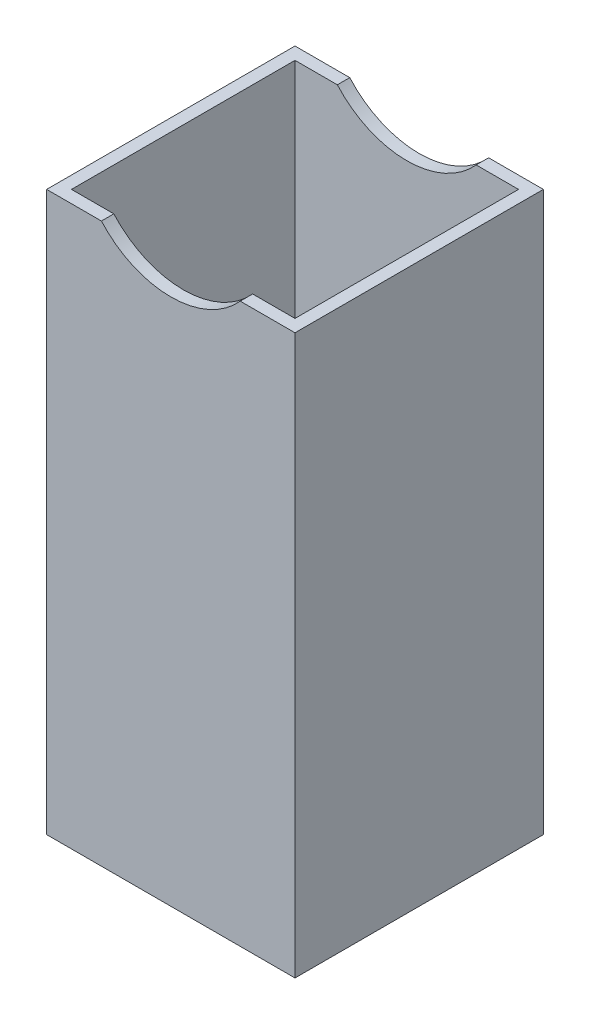
ISO-10303-21;
HEADER;
FILE_DESCRIPTION(('STEP AP214'),'2;1');
FILE_NAME('part.step','',(''),(''),'','','');
FILE_SCHEMA(('AUTOMOTIVE_DESIGN { 1 0 10303 214 1 1 1 1 }'));
ENDSEC;
DATA;
#1=APPLICATION_CONTEXT('core data for automotive mechanical design processes');
#2=APPLICATION_PROTOCOL_DEFINITION('international standard','automotive_design',2000,#1);
#3=PRODUCT_CONTEXT('',#1,'mechanical');
#4=PRODUCT('Part','Part','',(#3));
#5=PRODUCT_RELATED_PRODUCT_CATEGORY('part','',(#4));
#6=PRODUCT_DEFINITION_FORMATION('','',#4);
#7=PRODUCT_DEFINITION_CONTEXT('part definition',#1,'design');
#8=PRODUCT_DEFINITION('design','',#6,#7);
#9=PRODUCT_DEFINITION_SHAPE('','',#8);
#10=(LENGTH_UNIT() NAMED_UNIT(*) SI_UNIT(.MILLI.,.METRE.));
#11=(NAMED_UNIT(*) PLANE_ANGLE_UNIT() SI_UNIT($,.RADIAN.));
#12=(NAMED_UNIT(*) SI_UNIT($,.STERADIAN.) SOLID_ANGLE_UNIT());
#13=UNCERTAINTY_MEASURE_WITH_UNIT(LENGTH_MEASURE(1.E-05),#10,'distance_accuracy_value','');
#14=(GEOMETRIC_REPRESENTATION_CONTEXT(3) GLOBAL_UNCERTAINTY_ASSIGNED_CONTEXT((#13)) GLOBAL_UNIT_ASSIGNED_CONTEXT((#10,
#11,#12)) REPRESENTATION_CONTEXT('',''));
#15=CARTESIAN_POINT('',(0.,0.,0.));
#16=DIRECTION('',(0.,0.,1.));
#17=DIRECTION('',(1.,0.,0.));
#18=AXIS2_PLACEMENT_3D('',#15,#16,#17);
#19=CARTESIAN_POINT('',(0.,0.,0.));
#20=DIRECTION('',(0.,-1.,0.));
#21=DIRECTION('',(0.,0.,-1.));
#22=AXIS2_PLACEMENT_3D('',#19,#20,#21);
#23=PLANE('',#22);
#24=DIRECTION('',(-1.,0.,0.));
#25=VECTOR('',#24,1.);
#26=CARTESIAN_POINT('',(-20.,0.,-20.));
#27=LINE('',#26,#25);
#28=CARTESIAN_POINT('',(20.,0.,-20.));
#29=VERTEX_POINT('',#28);
#30=CARTESIAN_POINT('',(11.1803398874989,0.,-20.));
#31=VERTEX_POINT('',#30);
#32=EDGE_CURVE('E158',#29,#31,#27,.T.);
#33=ORIENTED_EDGE('',*,*,#32,.T.);
#34=DIRECTION('',(0.,0.,1.));
#35=VECTOR('',#34,1.);
#36=CARTESIAN_POINT('',(11.1803398874989,0.,-30.));
#37=LINE('',#36,#35);
#38=CARTESIAN_POINT('',(11.180339887499,0.,-18.));
#39=VERTEX_POINT('',#38);
#40=EDGE_CURVE('E217',#31,#39,#37,.T.);
#41=ORIENTED_EDGE('',*,*,#40,.T.);
#42=DIRECTION('',(-1.,0.,0.));
#43=VECTOR('',#42,1.);
#44=CARTESIAN_POINT('',(-18.,0.,-18.));
#45=LINE('',#44,#43);
#46=CARTESIAN_POINT('',(18.,0.,-18.));
#47=VERTEX_POINT('',#46);
#48=EDGE_CURVE('E179',#39,#47,#45,.F.);
#49=ORIENTED_EDGE('',*,*,#48,.T.);
#50=DIRECTION('',(0.,0.,-1.));
#51=VECTOR('',#50,1.);
#52=CARTESIAN_POINT('',(18.,0.,18.));
#53=LINE('',#52,#51);
#54=CARTESIAN_POINT('',(18.,0.,18.));
#55=VERTEX_POINT('',#54);
#56=EDGE_CURVE('E203',#47,#55,#53,.F.);
#57=ORIENTED_EDGE('',*,*,#56,.T.);
#58=DIRECTION('',(1.,0.,0.));
#59=VECTOR('',#58,1.);
#60=CARTESIAN_POINT('',(-18.,0.,18.));
#61=LINE('',#60,#59);
#62=CARTESIAN_POINT('',(11.180339887499,0.,18.));
#63=VERTEX_POINT('',#62);
#64=EDGE_CURVE('E189',#55,#63,#61,.F.);
#65=ORIENTED_EDGE('',*,*,#64,.T.);
#66=CARTESIAN_POINT('',(11.1803398874989,0.,20.));
#67=VERTEX_POINT('',#66);
#68=EDGE_CURVE('E62',#63,#67,#37,.T.);
#69=ORIENTED_EDGE('',*,*,#68,.T.);
#70=DIRECTION('',(1.,0.,0.));
#71=VECTOR('',#70,1.);
#72=CARTESIAN_POINT('',(-20.,0.,20.));
#73=LINE('',#72,#71);
#74=CARTESIAN_POINT('',(20.,0.,20.));
#75=VERTEX_POINT('',#74);
#76=EDGE_CURVE('E139',#67,#75,#73,.T.);
#77=ORIENTED_EDGE('',*,*,#76,.T.);
#78=DIRECTION('',(0.,0.,-1.));
#79=VECTOR('',#78,1.);
#80=CARTESIAN_POINT('',(20.,0.,20.));
#81=LINE('',#80,#79);
#82=EDGE_CURVE('E154',#75,#29,#81,.T.);
#83=ORIENTED_EDGE('',*,*,#82,.T.);
#84=EDGE_LOOP('',(#33,#41,#49,#57,#65,#69,#77,#83));
#85=FACE_BOUND('',#84,.T.);
#86=ADVANCED_FACE('F39',(#85),#23,.F.);
#87=CARTESIAN_POINT('',(20.,0.,20.));
#88=DIRECTION('',(-1.,0.,0.));
#89=DIRECTION('',(0.,0.,1.));
#90=AXIS2_PLACEMENT_3D('',#87,#88,#89);
#91=PLANE('',#90);
#92=DIRECTION('',(0.,-1.,0.));
#93=VECTOR('',#92,1.);
#94=CARTESIAN_POINT('',(20.,0.,-20.));
#95=LINE('',#94,#93);
#96=CARTESIAN_POINT('',(20.,-90.,-20.));
#97=VERTEX_POINT('',#96);
#98=EDGE_CURVE('E162',#29,#97,#95,.T.);
#99=ORIENTED_EDGE('',*,*,#98,.F.);
#100=ORIENTED_EDGE('',*,*,#82,.F.);
#101=DIRECTION('',(0.,-1.,0.));
#102=VECTOR('',#101,1.);
#103=CARTESIAN_POINT('',(20.,0.,20.));
#104=LINE('',#103,#102);
#105=CARTESIAN_POINT('',(20.,-90.,20.));
#106=VERTEX_POINT('',#105);
#107=EDGE_CURVE('E166',#75,#106,#104,.T.);
#108=ORIENTED_EDGE('',*,*,#107,.T.);
#109=DIRECTION('',(0.,0.,-1.));
#110=VECTOR('',#109,1.);
#111=CARTESIAN_POINT('',(20.,-90.,20.));
#112=LINE('',#111,#110);
#113=EDGE_CURVE('E145',#106,#97,#112,.T.);
#114=ORIENTED_EDGE('',*,*,#113,.T.);
#115=EDGE_LOOP('',(#99,#100,#108,#114));
#116=FACE_BOUND('',#115,.T.);
#117=ADVANCED_FACE('F229',(#116),#91,.F.);
#118=CARTESIAN_POINT('',(-20.,0.,-20.));
#119=DIRECTION('',(0.,0.,1.));
#120=DIRECTION('',(1.,0.,0.));
#121=AXIS2_PLACEMENT_3D('',#118,#119,#120);
#122=PLANE('',#121);
#123=CARTESIAN_POINT('',(-11.1803398874989,0.,-20.));
#124=VERTEX_POINT('',#123);
#125=CARTESIAN_POINT('',(-20.,0.,-20.));
#126=VERTEX_POINT('',#125);
#127=EDGE_CURVE('E156',#124,#126,#27,.T.);
#128=ORIENTED_EDGE('',*,*,#127,.F.);
#129=CARTESIAN_POINT('',(0.,10.,-20.));
#130=DIRECTION('',(0.,0.,1.));
#131=DIRECTION('',(1.,0.,0.));
#132=AXIS2_PLACEMENT_3D('',#129,#130,#131);
#133=CIRCLE('',#132,15.);
#134=EDGE_CURVE('E169',#124,#31,#133,.T.);
#135=ORIENTED_EDGE('',*,*,#134,.T.);
#136=ORIENTED_EDGE('',*,*,#32,.F.);
#137=ORIENTED_EDGE('',*,*,#98,.T.);
#138=DIRECTION('',(-1.,0.,0.));
#139=VECTOR('',#138,1.);
#140=CARTESIAN_POINT('',(-20.,-90.,-20.));
#141=LINE('',#140,#139);
#142=CARTESIAN_POINT('',(-20.,-90.,-20.));
#143=VERTEX_POINT('',#142);
#144=EDGE_CURVE('E148',#97,#143,#141,.T.);
#145=ORIENTED_EDGE('',*,*,#144,.T.);
#146=DIRECTION('',(0.,-1.,0.));
#147=VECTOR('',#146,1.);
#148=CARTESIAN_POINT('',(-20.,0.,-20.));
#149=LINE('',#148,#147);
#150=EDGE_CURVE('E165',#126,#143,#149,.T.);
#151=ORIENTED_EDGE('',*,*,#150,.F.);
#152=EDGE_LOOP('',(#128,#135,#136,#137,#145,#151));
#153=FACE_BOUND('',#152,.T.);
#154=ADVANCED_FACE('F224',(#153),#122,.F.);
#155=CARTESIAN_POINT('',(-20.,0.,20.));
#156=DIRECTION('',(1.,0.,0.));
#157=DIRECTION('',(0.,0.,-1.));
#158=AXIS2_PLACEMENT_3D('',#155,#156,#157);
#159=PLANE('',#158);
#160=DIRECTION('',(0.,-1.,0.));
#161=VECTOR('',#160,1.);
#162=CARTESIAN_POINT('',(-20.,0.,20.));
#163=LINE('',#162,#161);
#164=CARTESIAN_POINT('',(-20.,0.,20.));
#165=VERTEX_POINT('',#164);
#166=CARTESIAN_POINT('',(-20.,-90.,20.));
#167=VERTEX_POINT('',#166);
#168=EDGE_CURVE('E157',#165,#167,#163,.T.);
#169=ORIENTED_EDGE('',*,*,#168,.F.);
#170=DIRECTION('',(0.,0.,1.));
#171=VECTOR('',#170,1.);
#172=CARTESIAN_POINT('',(-20.,0.,20.));
#173=LINE('',#172,#171);
#174=EDGE_CURVE('E143',#126,#165,#173,.T.);
#175=ORIENTED_EDGE('',*,*,#174,.F.);
#176=ORIENTED_EDGE('',*,*,#150,.T.);
#177=DIRECTION('',(0.,0.,1.));
#178=VECTOR('',#177,1.);
#179=CARTESIAN_POINT('',(-20.,-90.,20.));
#180=LINE('',#179,#178);
#181=EDGE_CURVE('E152',#143,#167,#180,.T.);
#182=ORIENTED_EDGE('',*,*,#181,.T.);
#183=EDGE_LOOP('',(#169,#175,#176,#182));
#184=FACE_BOUND('',#183,.T.);
#185=ADVANCED_FACE('F175',(#184),#159,.F.);
#186=CARTESIAN_POINT('',(-20.,0.,20.));
#187=DIRECTION('',(0.,0.,-1.));
#188=DIRECTION('',(-1.,0.,0.));
#189=AXIS2_PLACEMENT_3D('',#186,#187,#188);
#190=PLANE('',#189);
#191=ORIENTED_EDGE('',*,*,#76,.F.);
#192=CARTESIAN_POINT('',(0.,10.,20.));
#193=DIRECTION('',(0.,0.,1.));
#194=DIRECTION('',(1.,0.,0.));
#195=AXIS2_PLACEMENT_3D('',#192,#193,#194);
#196=CIRCLE('',#195,15.);
#197=CARTESIAN_POINT('',(-11.1803398874989,0.,20.));
#198=VERTEX_POINT('',#197);
#199=EDGE_CURVE('E128',#198,#67,#196,.T.);
#200=ORIENTED_EDGE('',*,*,#199,.F.);
#201=EDGE_CURVE('E137',#165,#198,#73,.T.);
#202=ORIENTED_EDGE('',*,*,#201,.F.);
#203=ORIENTED_EDGE('',*,*,#168,.T.);
#204=DIRECTION('',(1.,0.,0.));
#205=VECTOR('',#204,1.);
#206=CARTESIAN_POINT('',(-20.,-90.,20.));
#207=LINE('',#206,#205);
#208=EDGE_CURVE('E173',#167,#106,#207,.T.);
#209=ORIENTED_EDGE('',*,*,#208,.T.);
#210=ORIENTED_EDGE('',*,*,#107,.F.);
#211=EDGE_LOOP('',(#191,#200,#202,#203,#209,#210));
#212=FACE_BOUND('',#211,.T.);
#213=ADVANCED_FACE('F41',(#212),#190,.F.);
#214=ORIENTED_EDGE('',*,*,#201,.T.);
#215=DIRECTION('',(0.,0.,1.));
#216=VECTOR('',#215,1.);
#217=CARTESIAN_POINT('',(-11.1803398874989,0.,-30.));
#218=LINE('',#217,#216);
#219=CARTESIAN_POINT('',(-11.180339887499,0.,18.));
#220=VERTEX_POINT('',#219);
#221=EDGE_CURVE('E125',#198,#220,#218,.F.);
#222=ORIENTED_EDGE('',*,*,#221,.T.);
#223=CARTESIAN_POINT('',(-18.,0.,18.));
#224=VERTEX_POINT('',#223);
#225=EDGE_CURVE('E197',#220,#224,#61,.F.);
#226=ORIENTED_EDGE('',*,*,#225,.T.);
#227=DIRECTION('',(0.,0.,1.));
#228=VECTOR('',#227,1.);
#229=CARTESIAN_POINT('',(-18.,0.,18.));
#230=LINE('',#229,#228);
#231=CARTESIAN_POINT('',(-18.,0.,-18.));
#232=VERTEX_POINT('',#231);
#233=EDGE_CURVE('E185',#224,#232,#230,.F.);
#234=ORIENTED_EDGE('',*,*,#233,.T.);
#235=CARTESIAN_POINT('',(-11.180339887499,0.,-18.));
#236=VERTEX_POINT('',#235);
#237=EDGE_CURVE('E206',#232,#236,#45,.F.);
#238=ORIENTED_EDGE('',*,*,#237,.T.);
#239=EDGE_CURVE('E54',#236,#124,#218,.F.);
#240=ORIENTED_EDGE('',*,*,#239,.T.);
#241=ORIENTED_EDGE('',*,*,#127,.T.);
#242=ORIENTED_EDGE('',*,*,#174,.T.);
#243=EDGE_LOOP('',(#214,#222,#226,#234,#238,#240,#241,#242));
#244=FACE_BOUND('',#243,.T.);
#245=ADVANCED_FACE('F141',(#244),#23,.F.);
#246=CARTESIAN_POINT('',(0.,-90.,0.));
#247=DIRECTION('',(0.,-1.,0.));
#248=DIRECTION('',(0.,0.,-1.));
#249=AXIS2_PLACEMENT_3D('',#246,#247,#248);
#250=PLANE('',#249);
#251=ORIENTED_EDGE('',*,*,#113,.F.);
#252=ORIENTED_EDGE('',*,*,#208,.F.);
#253=ORIENTED_EDGE('',*,*,#181,.F.);
#254=ORIENTED_EDGE('',*,*,#144,.F.);
#255=EDGE_LOOP('',(#251,#252,#253,#254));
#256=FACE_BOUND('',#255,.T.);
#257=DIRECTION('',(0.,0.,1.));
#258=VECTOR('',#257,1.);
#259=CARTESIAN_POINT('',(-18.,-90.,18.));
#260=LINE('',#259,#258);
#261=CARTESIAN_POINT('',(-18.,-90.,18.));
#262=VERTEX_POINT('',#261);
#263=CARTESIAN_POINT('',(-18.,-90.,-18.));
#264=VERTEX_POINT('',#263);
#265=EDGE_CURVE('E47',#262,#264,#260,.F.);
#266=ORIENTED_EDGE('',*,*,#265,.F.);
#267=DIRECTION('',(1.,0.,0.));
#268=VECTOR('',#267,1.);
#269=CARTESIAN_POINT('',(-18.,-90.,18.));
#270=LINE('',#269,#268);
#271=CARTESIAN_POINT('',(18.,-90.,18.));
#272=VERTEX_POINT('',#271);
#273=EDGE_CURVE('E192',#272,#262,#270,.F.);
#274=ORIENTED_EDGE('',*,*,#273,.F.);
#275=DIRECTION('',(0.,0.,-1.));
#276=VECTOR('',#275,1.);
#277=CARTESIAN_POINT('',(18.,-90.,18.));
#278=LINE('',#277,#276);
#279=CARTESIAN_POINT('',(18.,-90.,-18.));
#280=VERTEX_POINT('',#279);
#281=EDGE_CURVE('E200',#280,#272,#278,.F.);
#282=ORIENTED_EDGE('',*,*,#281,.F.);
#283=DIRECTION('',(-1.,0.,0.));
#284=VECTOR('',#283,1.);
#285=CARTESIAN_POINT('',(-18.,-90.,-18.));
#286=LINE('',#285,#284);
#287=EDGE_CURVE('E209',#264,#280,#286,.F.);
#288=ORIENTED_EDGE('',*,*,#287,.F.);
#289=EDGE_LOOP('',(#266,#274,#282,#288));
#290=FACE_BOUND('',#289,.T.);
#291=ADVANCED_FACE('F230',(#256,#290),#250,.T.);
#292=CARTESIAN_POINT('',(-18.,0.,-18.));
#293=DIRECTION('',(0.,0.,-1.));
#294=DIRECTION('',(-1.,0.,0.));
#295=AXIS2_PLACEMENT_3D('',#292,#293,#294);
#296=PLANE('',#295);
#297=ORIENTED_EDGE('',*,*,#48,.F.);
#298=CARTESIAN_POINT('',(0.,10.,-18.));
#299=DIRECTION('',(0.,0.,-1.));
#300=DIRECTION('',(-1.,0.,0.));
#301=AXIS2_PLACEMENT_3D('',#298,#299,#300);
#302=CIRCLE('',#301,15.);
#303=EDGE_CURVE('E218',#39,#236,#302,.T.);
#304=ORIENTED_EDGE('',*,*,#303,.T.);
#305=ORIENTED_EDGE('',*,*,#237,.F.);
#306=DIRECTION('',(0.,-1.,0.));
#307=VECTOR('',#306,1.);
#308=CARTESIAN_POINT('',(-18.,0.,-18.));
#309=LINE('',#308,#307);
#310=EDGE_CURVE('E188',#232,#264,#309,.T.);
#311=ORIENTED_EDGE('',*,*,#310,.T.);
#312=ORIENTED_EDGE('',*,*,#287,.T.);
#313=DIRECTION('',(0.,-1.,0.));
#314=VECTOR('',#313,1.);
#315=CARTESIAN_POINT('',(18.,0.,-18.));
#316=LINE('',#315,#314);
#317=EDGE_CURVE('E202',#47,#280,#316,.T.);
#318=ORIENTED_EDGE('',*,*,#317,.F.);
#319=EDGE_LOOP('',(#297,#304,#305,#311,#312,#318));
#320=FACE_BOUND('',#319,.T.);
#321=ADVANCED_FACE('F233',(#320),#296,.F.);
#322=CARTESIAN_POINT('',(18.,0.,18.));
#323=DIRECTION('',(1.,0.,0.));
#324=DIRECTION('',(0.,0.,-1.));
#325=AXIS2_PLACEMENT_3D('',#322,#323,#324);
#326=PLANE('',#325);
#327=DIRECTION('',(0.,-1.,0.));
#328=VECTOR('',#327,1.);
#329=CARTESIAN_POINT('',(18.,0.,18.));
#330=LINE('',#329,#328);
#331=EDGE_CURVE('E194',#55,#272,#330,.T.);
#332=ORIENTED_EDGE('',*,*,#331,.F.);
#333=ORIENTED_EDGE('',*,*,#56,.F.);
#334=ORIENTED_EDGE('',*,*,#317,.T.);
#335=ORIENTED_EDGE('',*,*,#281,.T.);
#336=EDGE_LOOP('',(#332,#333,#334,#335));
#337=FACE_BOUND('',#336,.T.);
#338=ADVANCED_FACE('F249',(#337),#326,.F.);
#339=CARTESIAN_POINT('',(-18.,0.,18.));
#340=DIRECTION('',(0.,0.,1.));
#341=DIRECTION('',(1.,0.,0.));
#342=AXIS2_PLACEMENT_3D('',#339,#340,#341);
#343=PLANE('',#342);
#344=ORIENTED_EDGE('',*,*,#225,.F.);
#345=CARTESIAN_POINT('',(0.,10.,18.));
#346=DIRECTION('',(0.,0.,1.));
#347=DIRECTION('',(1.,0.,0.));
#348=AXIS2_PLACEMENT_3D('',#345,#346,#347);
#349=CIRCLE('',#348,15.);
#350=EDGE_CURVE('E11',#220,#63,#349,.T.);
#351=ORIENTED_EDGE('',*,*,#350,.T.);
#352=ORIENTED_EDGE('',*,*,#64,.F.);
#353=ORIENTED_EDGE('',*,*,#331,.T.);
#354=ORIENTED_EDGE('',*,*,#273,.T.);
#355=DIRECTION('',(0.,-1.,0.));
#356=VECTOR('',#355,1.);
#357=CARTESIAN_POINT('',(-18.,0.,18.));
#358=LINE('',#357,#356);
#359=EDGE_CURVE('E184',#224,#262,#358,.T.);
#360=ORIENTED_EDGE('',*,*,#359,.F.);
#361=EDGE_LOOP('',(#344,#351,#352,#353,#354,#360));
#362=FACE_BOUND('',#361,.T.);
#363=ADVANCED_FACE('F245',(#362),#343,.F.);
#364=CARTESIAN_POINT('',(-18.,0.,18.));
#365=DIRECTION('',(-1.,0.,0.));
#366=DIRECTION('',(0.,0.,1.));
#367=AXIS2_PLACEMENT_3D('',#364,#365,#366);
#368=PLANE('',#367);
#369=ORIENTED_EDGE('',*,*,#265,.T.);
#370=ORIENTED_EDGE('',*,*,#310,.F.);
#371=ORIENTED_EDGE('',*,*,#233,.F.);
#372=ORIENTED_EDGE('',*,*,#359,.T.);
#373=EDGE_LOOP('',(#369,#370,#371,#372));
#374=FACE_BOUND('',#373,.T.);
#375=ADVANCED_FACE('F243',(#374),#368,.F.);
#376=CARTESIAN_POINT('',(0.,10.,-30.));
#377=DIRECTION('',(0.,0.,1.));
#378=DIRECTION('',(1.,0.,0.));
#379=AXIS2_PLACEMENT_3D('',#376,#377,#378);
#380=CYLINDRICAL_SURFACE('',#379,15.);
#381=ORIENTED_EDGE('',*,*,#350,.F.);
#382=ORIENTED_EDGE('',*,*,#221,.F.);
#383=ORIENTED_EDGE('',*,*,#199,.T.);
#384=ORIENTED_EDGE('',*,*,#68,.F.);
#385=EDGE_LOOP('',(#381,#382,#383,#384));
#386=FACE_BOUND('',#385,.T.);
#387=ADVANCED_FACE('F127',(#386),#380,.F.);
#388=ORIENTED_EDGE('',*,*,#239,.F.);
#389=ORIENTED_EDGE('',*,*,#303,.F.);
#390=ORIENTED_EDGE('',*,*,#40,.F.);
#391=ORIENTED_EDGE('',*,*,#134,.F.);
#392=EDGE_LOOP('',(#388,#389,#390,#391));
#393=FACE_BOUND('',#392,.T.);
#394=ADVANCED_FACE('F252',(#393),#380,.F.);
#395=CLOSED_SHELL('',(#86,#117,#154,#185,#213,#245,#291,#321,#338,#363,#375,#387,#394));
#396=MANIFOLD_SOLID_BREP('B2',#395);
#397=ADVANCED_BREP_SHAPE_REPRESENTATION('',(#18,#396),#14);
#398=SHAPE_DEFINITION_REPRESENTATION(#9,#397);
ENDSEC;
END-ISO-10303-21;
